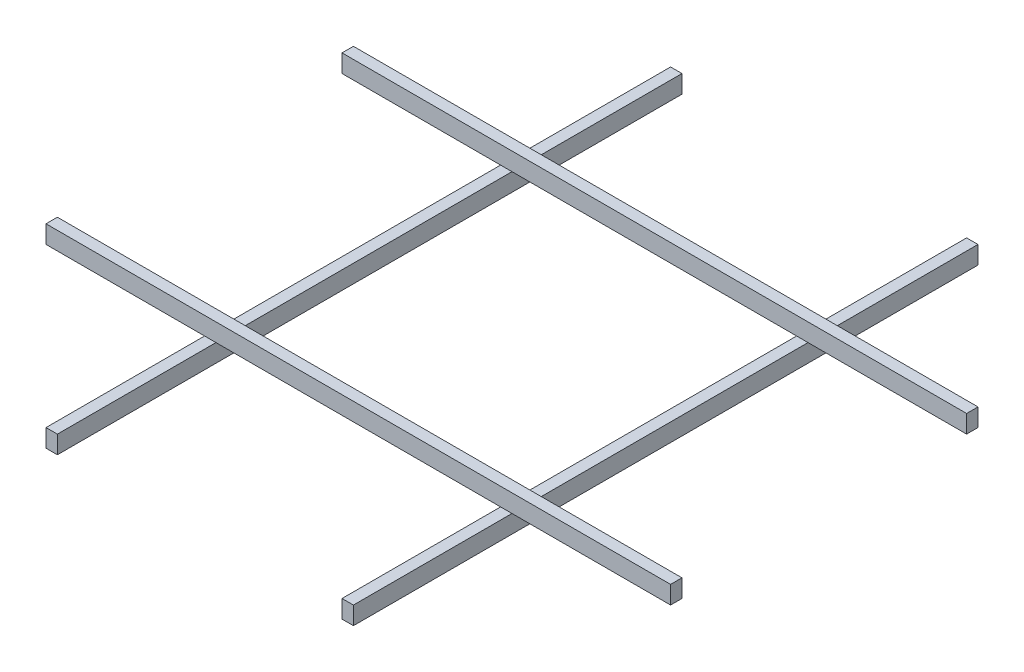
ISO-10303-21;
HEADER;
FILE_DESCRIPTION(('STEP AP214'),'2;1');
FILE_NAME('part.step','',(''),(''),'','','');
FILE_SCHEMA(('AUTOMOTIVE_DESIGN { 1 0 10303 214 1 1 1 1 }'));
ENDSEC;
DATA;
#1=APPLICATION_CONTEXT('core data for automotive mechanical design processes');
#2=APPLICATION_PROTOCOL_DEFINITION('international standard','automotive_design',2000,#1);
#3=PRODUCT_CONTEXT('',#1,'mechanical');
#4=PRODUCT('Part','Part','',(#3));
#5=PRODUCT_RELATED_PRODUCT_CATEGORY('part','',(#4));
#6=PRODUCT_DEFINITION_FORMATION('','',#4);
#7=PRODUCT_DEFINITION_CONTEXT('part definition',#1,'design');
#8=PRODUCT_DEFINITION('design','',#6,#7);
#9=PRODUCT_DEFINITION_SHAPE('','',#8);
#10=(LENGTH_UNIT() NAMED_UNIT(*) SI_UNIT(.MILLI.,.METRE.));
#11=(NAMED_UNIT(*) PLANE_ANGLE_UNIT() SI_UNIT($,.RADIAN.));
#12=(NAMED_UNIT(*) SI_UNIT($,.STERADIAN.) SOLID_ANGLE_UNIT());
#13=UNCERTAINTY_MEASURE_WITH_UNIT(LENGTH_MEASURE(1.E-05),#10,'distance_accuracy_value','');
#14=(GEOMETRIC_REPRESENTATION_CONTEXT(3) GLOBAL_UNCERTAINTY_ASSIGNED_CONTEXT((#13)) GLOBAL_UNIT_ASSIGNED_CONTEXT((#10,
#11,#12)) REPRESENTATION_CONTEXT('',''));
#15=CARTESIAN_POINT('',(0.,0.,0.));
#16=DIRECTION('',(0.,0.,1.));
#17=DIRECTION('',(1.,0.,0.));
#18=AXIS2_PLACEMENT_3D('',#15,#16,#17);
#19=CARTESIAN_POINT('',(4572.,209.55,-1327.15));
#20=DIRECTION('',(0.,0.,1.));
#21=DIRECTION('',(1.,0.,0.));
#22=AXIS2_PLACEMENT_3D('',#19,#20,#21);
#23=PLANE('',#22);
#24=DIRECTION('',(0.,1.,0.));
#25=VECTOR('',#24,1.);
#26=CARTESIAN_POINT('',(-304.8,209.55,-1327.15));
#27=LINE('',#26,#25);
#28=CARTESIAN_POINT('',(-304.8,69.85,-1327.15));
#29=VERTEX_POINT('',#28);
#30=CARTESIAN_POINT('',(-304.8,209.55,-1327.15));
#31=VERTEX_POINT('',#30);
#32=EDGE_CURVE('E131',#29,#31,#27,.T.);
#33=ORIENTED_EDGE('',*,*,#32,.T.);
#34=DIRECTION('',(-1.,0.,0.));
#35=VECTOR('',#34,1.);
#36=CARTESIAN_POINT('',(4572.,209.55,-1327.15));
#37=LINE('',#36,#35);
#38=CARTESIAN_POINT('',(4572.,209.55,-1327.15));
#39=VERTEX_POINT('',#38);
#40=EDGE_CURVE('E13',#39,#31,#37,.T.);
#41=ORIENTED_EDGE('',*,*,#40,.F.);
#42=DIRECTION('',(0.,1.,0.));
#43=VECTOR('',#42,1.);
#44=CARTESIAN_POINT('',(4572.,209.55,-1327.15));
#45=LINE('',#44,#43);
#46=CARTESIAN_POINT('',(4572.,69.85,-1327.15));
#47=VERTEX_POINT('',#46);
#48=EDGE_CURVE('E119',#47,#39,#45,.T.);
#49=ORIENTED_EDGE('',*,*,#48,.F.);
#50=DIRECTION('',(-1.,0.,0.));
#51=VECTOR('',#50,1.);
#52=CARTESIAN_POINT('',(4572.,69.85,-1327.15));
#53=LINE('',#52,#51);
#54=EDGE_CURVE('E127',#47,#29,#53,.T.);
#55=ORIENTED_EDGE('',*,*,#54,.T.);
#56=EDGE_LOOP('',(#33,#41,#49,#55));
#57=FACE_BOUND('',#56,.T.);
#58=ADVANCED_FACE('F68',(#57),#23,.F.);
#59=CARTESIAN_POINT('',(4572.,209.55,-1238.25));
#60=DIRECTION('',(0.,-1.,0.));
#61=DIRECTION('',(0.,0.,-1.));
#62=AXIS2_PLACEMENT_3D('',#59,#60,#61);
#63=PLANE('',#62);
#64=DIRECTION('',(0.,0.,1.));
#65=VECTOR('',#64,1.);
#66=CARTESIAN_POINT('',(-304.8,209.55,-1238.25));
#67=LINE('',#66,#65);
#68=CARTESIAN_POINT('',(-304.8,209.55,-1238.25));
#69=VERTEX_POINT('',#68);
#70=EDGE_CURVE('E123',#31,#69,#67,.T.);
#71=ORIENTED_EDGE('',*,*,#70,.T.);
#72=DIRECTION('',(-1.,0.,0.));
#73=VECTOR('',#72,1.);
#74=CARTESIAN_POINT('',(4572.,209.55,-1238.25));
#75=LINE('',#74,#73);
#76=CARTESIAN_POINT('',(4572.,209.55,-1238.25));
#77=VERTEX_POINT('',#76);
#78=EDGE_CURVE('E76',#77,#69,#75,.T.);
#79=ORIENTED_EDGE('',*,*,#78,.F.);
#80=DIRECTION('',(0.,0.,1.));
#81=VECTOR('',#80,1.);
#82=CARTESIAN_POINT('',(4572.,209.55,-1238.25));
#83=LINE('',#82,#81);
#84=EDGE_CURVE('E114',#39,#77,#83,.T.);
#85=ORIENTED_EDGE('',*,*,#84,.F.);
#86=ORIENTED_EDGE('',*,*,#40,.T.);
#87=EDGE_LOOP('',(#71,#79,#85,#86));
#88=FACE_BOUND('',#87,.T.);
#89=ADVANCED_FACE('F122',(#88),#63,.F.);
#90=CARTESIAN_POINT('',(4572.,209.55,-1238.25));
#91=DIRECTION('',(0.,0.,-1.));
#92=DIRECTION('',(0.,1.,0.));
#93=AXIS2_PLACEMENT_3D('',#90,#91,#92);
#94=PLANE('',#93);
#95=DIRECTION('',(0.,-1.,0.));
#96=VECTOR('',#95,1.);
#97=CARTESIAN_POINT('',(-304.8,209.55,-1238.25));
#98=LINE('',#97,#96);
#99=CARTESIAN_POINT('',(-304.8,69.85,-1238.25));
#100=VERTEX_POINT('',#99);
#101=EDGE_CURVE('E101',#69,#100,#98,.T.);
#102=ORIENTED_EDGE('',*,*,#101,.T.);
#103=DIRECTION('',(-1.,0.,0.));
#104=VECTOR('',#103,1.);
#105=CARTESIAN_POINT('',(4572.,69.85,-1238.25));
#106=LINE('',#105,#104);
#107=CARTESIAN_POINT('',(4572.,69.85,-1238.25));
#108=VERTEX_POINT('',#107);
#109=EDGE_CURVE('E124',#108,#100,#106,.T.);
#110=ORIENTED_EDGE('',*,*,#109,.F.);
#111=DIRECTION('',(0.,-1.,0.));
#112=VECTOR('',#111,1.);
#113=CARTESIAN_POINT('',(4572.,209.55,-1238.25));
#114=LINE('',#113,#112);
#115=EDGE_CURVE('E117',#77,#108,#114,.T.);
#116=ORIENTED_EDGE('',*,*,#115,.F.);
#117=ORIENTED_EDGE('',*,*,#78,.T.);
#118=EDGE_LOOP('',(#102,#110,#116,#117));
#119=FACE_BOUND('',#118,.T.);
#120=ADVANCED_FACE('F125',(#119),#94,.F.);
#121=CARTESIAN_POINT('',(4572.,69.85,-1238.25));
#122=DIRECTION('',(0.,1.,0.));
#123=DIRECTION('',(0.,0.,1.));
#124=AXIS2_PLACEMENT_3D('',#121,#122,#123);
#125=PLANE('',#124);
#126=DIRECTION('',(0.,0.,-1.));
#127=VECTOR('',#126,1.);
#128=CARTESIAN_POINT('',(-304.8,69.85,-1238.25));
#129=LINE('',#128,#127);
#130=EDGE_CURVE('E107',#100,#29,#129,.T.);
#131=ORIENTED_EDGE('',*,*,#130,.T.);
#132=ORIENTED_EDGE('',*,*,#54,.F.);
#133=DIRECTION('',(0.,0.,-1.));
#134=VECTOR('',#133,1.);
#135=CARTESIAN_POINT('',(4572.,69.85,-1238.25));
#136=LINE('',#135,#134);
#137=EDGE_CURVE('E84',#108,#47,#136,.T.);
#138=ORIENTED_EDGE('',*,*,#137,.F.);
#139=ORIENTED_EDGE('',*,*,#109,.T.);
#140=EDGE_LOOP('',(#131,#132,#138,#139));
#141=FACE_BOUND('',#140,.T.);
#142=ADVANCED_FACE('F138',(#141),#125,.F.);
#143=CARTESIAN_POINT('',(4572.,139.7,-2260.6));
#144=DIRECTION('',(1.,0.,0.));
#145=DIRECTION('',(0.,0.,-1.));
#146=AXIS2_PLACEMENT_3D('',#143,#144,#145);
#147=PLANE('',#146);
#148=ORIENTED_EDGE('',*,*,#48,.T.);
#149=ORIENTED_EDGE('',*,*,#84,.T.);
#150=ORIENTED_EDGE('',*,*,#115,.T.);
#151=ORIENTED_EDGE('',*,*,#137,.T.);
#152=EDGE_LOOP('',(#148,#149,#150,#151));
#153=FACE_BOUND('',#152,.T.);
#154=ADVANCED_FACE('F115',(#153),#147,.T.);
#155=CARTESIAN_POINT('',(-304.8,139.7,-2260.6));
#156=DIRECTION('',(1.,0.,0.));
#157=DIRECTION('',(0.,0.,-1.));
#158=AXIS2_PLACEMENT_3D('',#155,#156,#157);
#159=PLANE('',#158);
#160=ORIENTED_EDGE('',*,*,#32,.F.);
#161=ORIENTED_EDGE('',*,*,#130,.F.);
#162=ORIENTED_EDGE('',*,*,#101,.F.);
#163=ORIENTED_EDGE('',*,*,#70,.F.);
#164=EDGE_LOOP('',(#160,#161,#162,#163));
#165=FACE_BOUND('',#164,.T.);
#166=ADVANCED_FACE('F141',(#165),#159,.F.);
#167=CLOSED_SHELL('',(#58,#89,#120,#142,#154,#166));
#168=MANIFOLD_SOLID_BREP('B2',#167);
#169=CARTESIAN_POINT('',(4572.,209.55,-3638.55));
#170=DIRECTION('',(0.,0.,1.));
#171=DIRECTION('',(1.,0.,0.));
#172=AXIS2_PLACEMENT_3D('',#169,#170,#171);
#173=PLANE('',#172);
#174=DIRECTION('',(0.,1.,0.));
#175=VECTOR('',#174,1.);
#176=CARTESIAN_POINT('',(-304.8,209.55,-3638.55));
#177=LINE('',#176,#175);
#178=CARTESIAN_POINT('',(-304.8,69.85,-3638.55));
#179=VERTEX_POINT('',#178);
#180=CARTESIAN_POINT('',(-304.8,209.55,-3638.55));
#181=VERTEX_POINT('',#180);
#182=EDGE_CURVE('E291',#179,#181,#177,.T.);
#183=ORIENTED_EDGE('',*,*,#182,.T.);
#184=DIRECTION('',(-1.,0.,0.));
#185=VECTOR('',#184,1.);
#186=CARTESIAN_POINT('',(4572.,209.55,-3638.55));
#187=LINE('',#186,#185);
#188=CARTESIAN_POINT('',(4572.,209.55,-3638.55));
#189=VERTEX_POINT('',#188);
#190=EDGE_CURVE('E66',#189,#181,#187,.T.);
#191=ORIENTED_EDGE('',*,*,#190,.F.);
#192=DIRECTION('',(0.,1.,0.));
#193=VECTOR('',#192,1.);
#194=CARTESIAN_POINT('',(4572.,209.55,-3638.55));
#195=LINE('',#194,#193);
#196=CARTESIAN_POINT('',(4572.,69.85,-3638.55));
#197=VERTEX_POINT('',#196);
#198=EDGE_CURVE('E278',#197,#189,#195,.T.);
#199=ORIENTED_EDGE('',*,*,#198,.F.);
#200=DIRECTION('',(-1.,0.,0.));
#201=VECTOR('',#200,1.);
#202=CARTESIAN_POINT('',(4572.,69.85,-3638.55));
#203=LINE('',#202,#201);
#204=EDGE_CURVE('E287',#197,#179,#203,.T.);
#205=ORIENTED_EDGE('',*,*,#204,.T.);
#206=EDGE_LOOP('',(#183,#191,#199,#205));
#207=FACE_BOUND('',#206,.T.);
#208=ADVANCED_FACE('F226',(#207),#173,.F.);
#209=CARTESIAN_POINT('',(4572.,209.55,-3549.65));
#210=DIRECTION('',(0.,-1.,0.));
#211=DIRECTION('',(0.,0.,-1.));
#212=AXIS2_PLACEMENT_3D('',#209,#210,#211);
#213=PLANE('',#212);
#214=DIRECTION('',(0.,0.,1.));
#215=VECTOR('',#214,1.);
#216=CARTESIAN_POINT('',(-304.8,209.55,-3549.65));
#217=LINE('',#216,#215);
#218=CARTESIAN_POINT('',(-304.8,209.55,-3549.65));
#219=VERTEX_POINT('',#218);
#220=EDGE_CURVE('E282',#181,#219,#217,.T.);
#221=ORIENTED_EDGE('',*,*,#220,.T.);
#222=DIRECTION('',(-1.,0.,0.));
#223=VECTOR('',#222,1.);
#224=CARTESIAN_POINT('',(4572.,209.55,-3549.65));
#225=LINE('',#224,#223);
#226=CARTESIAN_POINT('',(4572.,209.55,-3549.65));
#227=VERTEX_POINT('',#226);
#228=EDGE_CURVE('E235',#227,#219,#225,.T.);
#229=ORIENTED_EDGE('',*,*,#228,.F.);
#230=DIRECTION('',(0.,0.,1.));
#231=VECTOR('',#230,1.);
#232=CARTESIAN_POINT('',(4572.,209.55,-3549.65));
#233=LINE('',#232,#231);
#234=EDGE_CURVE('E273',#189,#227,#233,.T.);
#235=ORIENTED_EDGE('',*,*,#234,.F.);
#236=ORIENTED_EDGE('',*,*,#190,.T.);
#237=EDGE_LOOP('',(#221,#229,#235,#236));
#238=FACE_BOUND('',#237,.T.);
#239=ADVANCED_FACE('F281',(#238),#213,.F.);
#240=CARTESIAN_POINT('',(4572.,209.55,-3549.65));
#241=DIRECTION('',(0.,0.,-1.));
#242=DIRECTION('',(0.,1.,0.));
#243=AXIS2_PLACEMENT_3D('',#240,#241,#242);
#244=PLANE('',#243);
#245=DIRECTION('',(0.,-1.,0.));
#246=VECTOR('',#245,1.);
#247=CARTESIAN_POINT('',(-304.8,209.55,-3549.65));
#248=LINE('',#247,#246);
#249=CARTESIAN_POINT('',(-304.8,69.85,-3549.65));
#250=VERTEX_POINT('',#249);
#251=EDGE_CURVE('E260',#219,#250,#248,.T.);
#252=ORIENTED_EDGE('',*,*,#251,.T.);
#253=DIRECTION('',(-1.,0.,0.));
#254=VECTOR('',#253,1.);
#255=CARTESIAN_POINT('',(4572.,69.85,-3549.65));
#256=LINE('',#255,#254);
#257=CARTESIAN_POINT('',(4572.,69.85,-3549.65));
#258=VERTEX_POINT('',#257);
#259=EDGE_CURVE('E284',#258,#250,#256,.T.);
#260=ORIENTED_EDGE('',*,*,#259,.F.);
#261=DIRECTION('',(0.,-1.,0.));
#262=VECTOR('',#261,1.);
#263=CARTESIAN_POINT('',(4572.,209.55,-3549.65));
#264=LINE('',#263,#262);
#265=EDGE_CURVE('E276',#227,#258,#264,.T.);
#266=ORIENTED_EDGE('',*,*,#265,.F.);
#267=ORIENTED_EDGE('',*,*,#228,.T.);
#268=EDGE_LOOP('',(#252,#260,#266,#267));
#269=FACE_BOUND('',#268,.T.);
#270=ADVANCED_FACE('F285',(#269),#244,.F.);
#271=CARTESIAN_POINT('',(4572.,69.85,-3549.65));
#272=DIRECTION('',(0.,1.,0.));
#273=DIRECTION('',(0.,0.,1.));
#274=AXIS2_PLACEMENT_3D('',#271,#272,#273);
#275=PLANE('',#274);
#276=DIRECTION('',(0.,0.,-1.));
#277=VECTOR('',#276,1.);
#278=CARTESIAN_POINT('',(-304.8,69.85,-3549.65));
#279=LINE('',#278,#277);
#280=EDGE_CURVE('E266',#250,#179,#279,.T.);
#281=ORIENTED_EDGE('',*,*,#280,.T.);
#282=ORIENTED_EDGE('',*,*,#204,.F.);
#283=DIRECTION('',(0.,0.,-1.));
#284=VECTOR('',#283,1.);
#285=CARTESIAN_POINT('',(4572.,69.85,-3549.65));
#286=LINE('',#285,#284);
#287=EDGE_CURVE('E243',#258,#197,#286,.T.);
#288=ORIENTED_EDGE('',*,*,#287,.F.);
#289=ORIENTED_EDGE('',*,*,#259,.T.);
#290=EDGE_LOOP('',(#281,#282,#288,#289));
#291=FACE_BOUND('',#290,.T.);
#292=ADVANCED_FACE('F300',(#291),#275,.F.);
#293=CARTESIAN_POINT('',(4572.,139.7,-4572.));
#294=DIRECTION('',(1.,0.,0.));
#295=DIRECTION('',(0.,0.,-1.));
#296=AXIS2_PLACEMENT_3D('',#293,#294,#295);
#297=PLANE('',#296);
#298=ORIENTED_EDGE('',*,*,#198,.T.);
#299=ORIENTED_EDGE('',*,*,#234,.T.);
#300=ORIENTED_EDGE('',*,*,#265,.T.);
#301=ORIENTED_EDGE('',*,*,#287,.T.);
#302=EDGE_LOOP('',(#298,#299,#300,#301));
#303=FACE_BOUND('',#302,.T.);
#304=ADVANCED_FACE('F274',(#303),#297,.T.);
#305=CARTESIAN_POINT('',(-304.8,139.7,-4572.));
#306=DIRECTION('',(1.,0.,0.));
#307=DIRECTION('',(0.,0.,-1.));
#308=AXIS2_PLACEMENT_3D('',#305,#306,#307);
#309=PLANE('',#308);
#310=ORIENTED_EDGE('',*,*,#182,.F.);
#311=ORIENTED_EDGE('',*,*,#280,.F.);
#312=ORIENTED_EDGE('',*,*,#251,.F.);
#313=ORIENTED_EDGE('',*,*,#220,.F.);
#314=EDGE_LOOP('',(#310,#311,#312,#313));
#315=FACE_BOUND('',#314,.T.);
#316=ADVANCED_FACE('F303',(#315),#309,.F.);
#317=CLOSED_SHELL('',(#208,#239,#270,#292,#304,#316));
#318=MANIFOLD_SOLID_BREP('B7',#317);
#319=CARTESIAN_POINT('',(3244.85,69.85,-4876.8));
#320=DIRECTION('',(1.,0.,0.));
#321=DIRECTION('',(0.,0.,-1.));
#322=AXIS2_PLACEMENT_3D('',#319,#320,#321);
#323=PLANE('',#322);
#324=DIRECTION('',(0.,1.,0.));
#325=VECTOR('',#324,1.);
#326=CARTESIAN_POINT('',(3244.85,69.85,1.79637315732929E-13));
#327=LINE('',#326,#325);
#328=CARTESIAN_POINT('',(3244.85,-69.85,1.79637315732929E-13));
#329=VERTEX_POINT('',#328);
#330=CARTESIAN_POINT('',(3244.85,69.85,1.79637315732929E-13));
#331=VERTEX_POINT('',#330);
#332=EDGE_CURVE('E450',#329,#331,#327,.T.);
#333=ORIENTED_EDGE('',*,*,#332,.T.);
#334=DIRECTION('',(0.,0.,1.));
#335=VECTOR('',#334,1.);
#336=CARTESIAN_POINT('',(3244.85,69.85,-4876.8));
#337=LINE('',#336,#335);
#338=CARTESIAN_POINT('',(3244.85,69.85,-4876.8));
#339=VERTEX_POINT('',#338);
#340=EDGE_CURVE('E224',#339,#331,#337,.T.);
#341=ORIENTED_EDGE('',*,*,#340,.F.);
#342=DIRECTION('',(0.,1.,0.));
#343=VECTOR('',#342,1.);
#344=CARTESIAN_POINT('',(3244.85,69.85,-4876.8));
#345=LINE('',#344,#343);
#346=CARTESIAN_POINT('',(3244.85,-69.85,-4876.8));
#347=VERTEX_POINT('',#346);
#348=EDGE_CURVE('E438',#347,#339,#345,.T.);
#349=ORIENTED_EDGE('',*,*,#348,.F.);
#350=DIRECTION('',(0.,0.,1.));
#351=VECTOR('',#350,1.);
#352=CARTESIAN_POINT('',(3244.85,-69.85,-4876.8));
#353=LINE('',#352,#351);
#354=EDGE_CURVE('E446',#347,#329,#353,.T.);
#355=ORIENTED_EDGE('',*,*,#354,.T.);
#356=EDGE_LOOP('',(#333,#341,#349,#355));
#357=FACE_BOUND('',#356,.T.);
#358=ADVANCED_FACE('F387',(#357),#323,.F.);
#359=CARTESIAN_POINT('',(3333.75,69.85,-4876.8));
#360=DIRECTION('',(0.,-1.,0.));
#361=DIRECTION('',(0.,0.,-1.));
#362=AXIS2_PLACEMENT_3D('',#359,#360,#361);
#363=PLANE('',#362);
#364=DIRECTION('',(1.,0.,0.));
#365=VECTOR('',#364,1.);
#366=CARTESIAN_POINT('',(3333.75,69.85,1.79637315732929E-13));
#367=LINE('',#366,#365);
#368=CARTESIAN_POINT('',(3333.75,69.85,1.79637315732929E-13));
#369=VERTEX_POINT('',#368);
#370=EDGE_CURVE('E442',#331,#369,#367,.T.);
#371=ORIENTED_EDGE('',*,*,#370,.T.);
#372=DIRECTION('',(0.,0.,1.));
#373=VECTOR('',#372,1.);
#374=CARTESIAN_POINT('',(3333.75,69.85,-4876.8));
#375=LINE('',#374,#373);
#376=CARTESIAN_POINT('',(3333.75,69.85,-4876.8));
#377=VERTEX_POINT('',#376);
#378=EDGE_CURVE('E395',#377,#369,#375,.T.);
#379=ORIENTED_EDGE('',*,*,#378,.F.);
#380=DIRECTION('',(1.,0.,0.));
#381=VECTOR('',#380,1.);
#382=CARTESIAN_POINT('',(3333.75,69.85,-4876.8));
#383=LINE('',#382,#381);
#384=EDGE_CURVE('E433',#339,#377,#383,.T.);
#385=ORIENTED_EDGE('',*,*,#384,.F.);
#386=ORIENTED_EDGE('',*,*,#340,.T.);
#387=EDGE_LOOP('',(#371,#379,#385,#386));
#388=FACE_BOUND('',#387,.T.);
#389=ADVANCED_FACE('F441',(#388),#363,.F.);
#390=CARTESIAN_POINT('',(3333.75,69.85,-4876.8));
#391=DIRECTION('',(-1.,0.,0.));
#392=DIRECTION('',(0.,-1.,0.));
#393=AXIS2_PLACEMENT_3D('',#390,#391,#392);
#394=PLANE('',#393);
#395=DIRECTION('',(0.,-1.,0.));
#396=VECTOR('',#395,1.);
#397=CARTESIAN_POINT('',(3333.75,69.85,1.79637315732929E-13));
#398=LINE('',#397,#396);
#399=CARTESIAN_POINT('',(3333.75,-69.85,1.79637315732929E-13));
#400=VERTEX_POINT('',#399);
#401=EDGE_CURVE('E420',#369,#400,#398,.T.);
#402=ORIENTED_EDGE('',*,*,#401,.T.);
#403=DIRECTION('',(0.,0.,1.));
#404=VECTOR('',#403,1.);
#405=CARTESIAN_POINT('',(3333.75,-69.85,-4876.8));
#406=LINE('',#405,#404);
#407=CARTESIAN_POINT('',(3333.75,-69.85,-4876.8));
#408=VERTEX_POINT('',#407);
#409=EDGE_CURVE('E443',#408,#400,#406,.T.);
#410=ORIENTED_EDGE('',*,*,#409,.F.);
#411=DIRECTION('',(0.,-1.,0.));
#412=VECTOR('',#411,1.);
#413=CARTESIAN_POINT('',(3333.75,69.85,-4876.8));
#414=LINE('',#413,#412);
#415=EDGE_CURVE('E436',#377,#408,#414,.T.);
#416=ORIENTED_EDGE('',*,*,#415,.F.);
#417=ORIENTED_EDGE('',*,*,#378,.T.);
#418=EDGE_LOOP('',(#402,#410,#416,#417));
#419=FACE_BOUND('',#418,.T.);
#420=ADVANCED_FACE('F444',(#419),#394,.F.);
#421=CARTESIAN_POINT('',(3333.75,-69.85,-4876.8));
#422=DIRECTION('',(0.,1.,0.));
#423=DIRECTION('',(0.,0.,1.));
#424=AXIS2_PLACEMENT_3D('',#421,#422,#423);
#425=PLANE('',#424);
#426=DIRECTION('',(-1.,0.,0.));
#427=VECTOR('',#426,1.);
#428=CARTESIAN_POINT('',(3333.75,-69.85,1.79637315732929E-13));
#429=LINE('',#428,#427);
#430=EDGE_CURVE('E426',#400,#329,#429,.T.);
#431=ORIENTED_EDGE('',*,*,#430,.T.);
#432=ORIENTED_EDGE('',*,*,#354,.F.);
#433=DIRECTION('',(-1.,0.,0.));
#434=VECTOR('',#433,1.);
#435=CARTESIAN_POINT('',(3333.75,-69.85,-4876.8));
#436=LINE('',#435,#434);
#437=EDGE_CURVE('E403',#408,#347,#436,.T.);
#438=ORIENTED_EDGE('',*,*,#437,.F.);
#439=ORIENTED_EDGE('',*,*,#409,.T.);
#440=EDGE_LOOP('',(#431,#432,#438,#439));
#441=FACE_BOUND('',#440,.T.);
#442=ADVANCED_FACE('F457',(#441),#425,.F.);
#443=CARTESIAN_POINT('',(2311.4,0.,-4876.8));
#444=DIRECTION('',(0.,0.,-1.));
#445=DIRECTION('',(-1.,0.,0.));
#446=AXIS2_PLACEMENT_3D('',#443,#444,#445);
#447=PLANE('',#446);
#448=ORIENTED_EDGE('',*,*,#348,.T.);
#449=ORIENTED_EDGE('',*,*,#384,.T.);
#450=ORIENTED_EDGE('',*,*,#415,.T.);
#451=ORIENTED_EDGE('',*,*,#437,.T.);
#452=EDGE_LOOP('',(#448,#449,#450,#451));
#453=FACE_BOUND('',#452,.T.);
#454=ADVANCED_FACE('F434',(#453),#447,.T.);
#455=CARTESIAN_POINT('',(2311.4,0.,1.79637315732929E-13));
#456=DIRECTION('',(0.,0.,-1.));
#457=DIRECTION('',(-1.,0.,0.));
#458=AXIS2_PLACEMENT_3D('',#455,#456,#457);
#459=PLANE('',#458);
#460=ORIENTED_EDGE('',*,*,#332,.F.);
#461=ORIENTED_EDGE('',*,*,#430,.F.);
#462=ORIENTED_EDGE('',*,*,#401,.F.);
#463=ORIENTED_EDGE('',*,*,#370,.F.);
#464=EDGE_LOOP('',(#460,#461,#462,#463));
#465=FACE_BOUND('',#464,.T.);
#466=ADVANCED_FACE('F460',(#465),#459,.F.);
#467=CLOSED_SHELL('',(#358,#389,#420,#442,#454,#466));
#468=MANIFOLD_SOLID_BREP('B60',#467);
#469=CARTESIAN_POINT('',(933.45,69.85,-4876.8));
#470=DIRECTION('',(1.,0.,0.));
#471=DIRECTION('',(0.,0.,-1.));
#472=AXIS2_PLACEMENT_3D('',#469,#470,#471);
#473=PLANE('',#472);
#474=DIRECTION('',(0.,1.,0.));
#475=VECTOR('',#474,1.);
#476=CARTESIAN_POINT('',(933.45,69.85,8.88178419700125E-13));
#477=LINE('',#476,#475);
#478=CARTESIAN_POINT('',(933.45,-69.85,8.88178419700125E-13));
#479=VERTEX_POINT('',#478);
#480=CARTESIAN_POINT('',(933.45,69.85,8.88178419700125E-13));
#481=VERTEX_POINT('',#480);
#482=EDGE_CURVE('E598',#479,#481,#477,.T.);
#483=ORIENTED_EDGE('',*,*,#482,.T.);
#484=DIRECTION('',(0.,0.,1.));
#485=VECTOR('',#484,1.);
#486=CARTESIAN_POINT('',(933.45,69.85,-4876.8));
#487=LINE('',#486,#485);
#488=CARTESIAN_POINT('',(933.45,69.85,-4876.8));
#489=VERTEX_POINT('',#488);
#490=EDGE_CURVE('E385',#489,#481,#487,.T.);
#491=ORIENTED_EDGE('',*,*,#490,.F.);
#492=DIRECTION('',(0.,1.,0.));
#493=VECTOR('',#492,1.);
#494=CARTESIAN_POINT('',(933.45,69.85,-4876.8));
#495=LINE('',#494,#493);
#496=CARTESIAN_POINT('',(933.45,-69.85,-4876.8));
#497=VERTEX_POINT('',#496);
#498=EDGE_CURVE('E586',#497,#489,#495,.T.);
#499=ORIENTED_EDGE('',*,*,#498,.F.);
#500=DIRECTION('',(0.,0.,1.));
#501=VECTOR('',#500,1.);
#502=CARTESIAN_POINT('',(933.45,-69.85,-4876.8));
#503=LINE('',#502,#501);
#504=EDGE_CURVE('E594',#497,#479,#503,.T.);
#505=ORIENTED_EDGE('',*,*,#504,.T.);
#506=EDGE_LOOP('',(#483,#491,#499,#505));
#507=FACE_BOUND('',#506,.T.);
#508=ADVANCED_FACE('F535',(#507),#473,.F.);
#509=CARTESIAN_POINT('',(1022.35,69.85,-4876.8));
#510=DIRECTION('',(0.,-1.,0.));
#511=DIRECTION('',(0.,0.,-1.));
#512=AXIS2_PLACEMENT_3D('',#509,#510,#511);
#513=PLANE('',#512);
#514=DIRECTION('',(1.,0.,0.));
#515=VECTOR('',#514,1.);
#516=CARTESIAN_POINT('',(1022.35,69.85,8.88178419700125E-13));
#517=LINE('',#516,#515);
#518=CARTESIAN_POINT('',(1022.35,69.85,8.88178419700125E-13));
#519=VERTEX_POINT('',#518);
#520=EDGE_CURVE('E590',#481,#519,#517,.T.);
#521=ORIENTED_EDGE('',*,*,#520,.T.);
#522=DIRECTION('',(0.,0.,1.));
#523=VECTOR('',#522,1.);
#524=CARTESIAN_POINT('',(1022.35,69.85,-4876.8));
#525=LINE('',#524,#523);
#526=CARTESIAN_POINT('',(1022.35,69.85,-4876.8));
#527=VERTEX_POINT('',#526);
#528=EDGE_CURVE('E543',#527,#519,#525,.T.);
#529=ORIENTED_EDGE('',*,*,#528,.F.);
#530=DIRECTION('',(1.,0.,0.));
#531=VECTOR('',#530,1.);
#532=CARTESIAN_POINT('',(1022.35,69.85,-4876.8));
#533=LINE('',#532,#531);
#534=EDGE_CURVE('E581',#489,#527,#533,.T.);
#535=ORIENTED_EDGE('',*,*,#534,.F.);
#536=ORIENTED_EDGE('',*,*,#490,.T.);
#537=EDGE_LOOP('',(#521,#529,#535,#536));
#538=FACE_BOUND('',#537,.T.);
#539=ADVANCED_FACE('F589',(#538),#513,.F.);
#540=CARTESIAN_POINT('',(1022.35,69.85,-4876.8));
#541=DIRECTION('',(-1.,0.,0.));
#542=DIRECTION('',(0.,-1.,0.));
#543=AXIS2_PLACEMENT_3D('',#540,#541,#542);
#544=PLANE('',#543);
#545=DIRECTION('',(0.,-1.,0.));
#546=VECTOR('',#545,1.);
#547=CARTESIAN_POINT('',(1022.35,69.85,8.88178419700125E-13));
#548=LINE('',#547,#546);
#549=CARTESIAN_POINT('',(1022.35,-69.85,8.88178419700125E-13));
#550=VERTEX_POINT('',#549);
#551=EDGE_CURVE('E568',#519,#550,#548,.T.);
#552=ORIENTED_EDGE('',*,*,#551,.T.);
#553=DIRECTION('',(0.,0.,1.));
#554=VECTOR('',#553,1.);
#555=CARTESIAN_POINT('',(1022.35,-69.85,-4876.8));
#556=LINE('',#555,#554);
#557=CARTESIAN_POINT('',(1022.35,-69.85,-4876.8));
#558=VERTEX_POINT('',#557);
#559=EDGE_CURVE('E591',#558,#550,#556,.T.);
#560=ORIENTED_EDGE('',*,*,#559,.F.);
#561=DIRECTION('',(0.,-1.,0.));
#562=VECTOR('',#561,1.);
#563=CARTESIAN_POINT('',(1022.35,69.85,-4876.8));
#564=LINE('',#563,#562);
#565=EDGE_CURVE('E584',#527,#558,#564,.T.);
#566=ORIENTED_EDGE('',*,*,#565,.F.);
#567=ORIENTED_EDGE('',*,*,#528,.T.);
#568=EDGE_LOOP('',(#552,#560,#566,#567));
#569=FACE_BOUND('',#568,.T.);
#570=ADVANCED_FACE('F592',(#569),#544,.F.);
#571=CARTESIAN_POINT('',(1022.35,-69.85,-4876.8));
#572=DIRECTION('',(0.,1.,0.));
#573=DIRECTION('',(0.,0.,1.));
#574=AXIS2_PLACEMENT_3D('',#571,#572,#573);
#575=PLANE('',#574);
#576=DIRECTION('',(-1.,0.,0.));
#577=VECTOR('',#576,1.);
#578=CARTESIAN_POINT('',(1022.35,-69.85,8.88178419700125E-13));
#579=LINE('',#578,#577);
#580=EDGE_CURVE('E574',#550,#479,#579,.T.);
#581=ORIENTED_EDGE('',*,*,#580,.T.);
#582=ORIENTED_EDGE('',*,*,#504,.F.);
#583=DIRECTION('',(-1.,0.,0.));
#584=VECTOR('',#583,1.);
#585=CARTESIAN_POINT('',(1022.35,-69.85,-4876.8));
#586=LINE('',#585,#584);
#587=EDGE_CURVE('E551',#558,#497,#586,.T.);
#588=ORIENTED_EDGE('',*,*,#587,.F.);
#589=ORIENTED_EDGE('',*,*,#559,.T.);
#590=EDGE_LOOP('',(#581,#582,#588,#589));
#591=FACE_BOUND('',#590,.T.);
#592=ADVANCED_FACE('F605',(#591),#575,.F.);
#593=CARTESIAN_POINT('',(0.,0.,-4876.8));
#594=DIRECTION('',(0.,0.,-1.));
#595=DIRECTION('',(-1.,0.,0.));
#596=AXIS2_PLACEMENT_3D('',#593,#594,#595);
#597=PLANE('',#596);
#598=ORIENTED_EDGE('',*,*,#498,.T.);
#599=ORIENTED_EDGE('',*,*,#534,.T.);
#600=ORIENTED_EDGE('',*,*,#565,.T.);
#601=ORIENTED_EDGE('',*,*,#587,.T.);
#602=EDGE_LOOP('',(#598,#599,#600,#601));
#603=FACE_BOUND('',#602,.T.);
#604=ADVANCED_FACE('F582',(#603),#597,.T.);
#605=CARTESIAN_POINT('',(0.,0.,8.88178419700125E-13));
#606=DIRECTION('',(0.,0.,-1.));
#607=DIRECTION('',(-1.,0.,0.));
#608=AXIS2_PLACEMENT_3D('',#605,#606,#607);
#609=PLANE('',#608);
#610=ORIENTED_EDGE('',*,*,#482,.F.);
#611=ORIENTED_EDGE('',*,*,#580,.F.);
#612=ORIENTED_EDGE('',*,*,#551,.F.);
#613=ORIENTED_EDGE('',*,*,#520,.F.);
#614=EDGE_LOOP('',(#610,#611,#612,#613));
#615=FACE_BOUND('',#614,.T.);
#616=ADVANCED_FACE('F608',(#615),#609,.F.);
#617=CLOSED_SHELL('',(#508,#539,#570,#592,#604,#616));
#618=MANIFOLD_SOLID_BREP('B218',#617);
#619=ADVANCED_BREP_SHAPE_REPRESENTATION('',(#18,#168,#318,#468,#618),#14);
#620=SHAPE_DEFINITION_REPRESENTATION(#9,#619);
ENDSEC;
END-ISO-10303-21;
